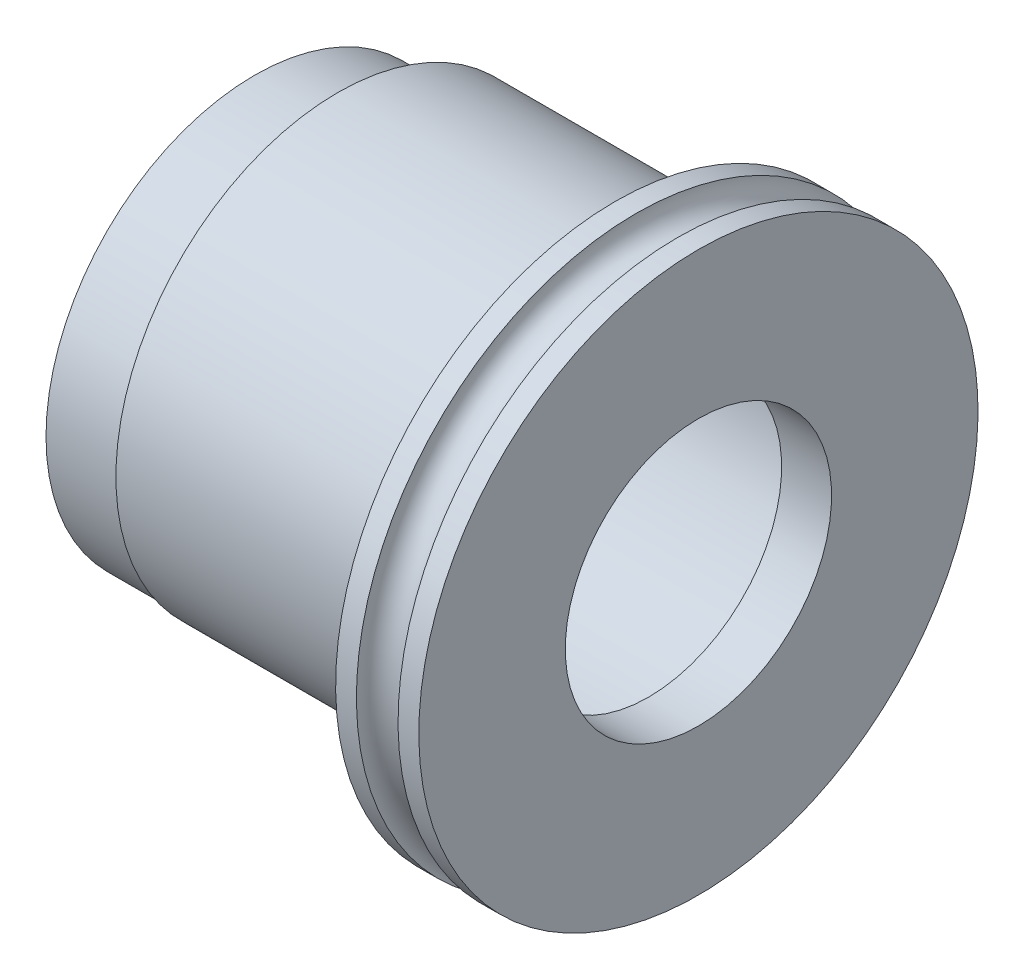
ISO-10303-21;
HEADER;
FILE_DESCRIPTION(('STEP AP214'),'2;1');
FILE_NAME('part.step','',(''),(''),'','','');
FILE_SCHEMA(('AUTOMOTIVE_DESIGN { 1 0 10303 214 1 1 1 1 }'));
ENDSEC;
DATA;
#1=APPLICATION_CONTEXT('core data for automotive mechanical design processes');
#2=APPLICATION_PROTOCOL_DEFINITION('international standard','automotive_design',2000,#1);
#3=PRODUCT_CONTEXT('',#1,'mechanical');
#4=PRODUCT('Part','Part','',(#3));
#5=PRODUCT_RELATED_PRODUCT_CATEGORY('part','',(#4));
#6=PRODUCT_DEFINITION_FORMATION('','',#4);
#7=PRODUCT_DEFINITION_CONTEXT('part definition',#1,'design');
#8=PRODUCT_DEFINITION('design','',#6,#7);
#9=PRODUCT_DEFINITION_SHAPE('','',#8);
#10=(LENGTH_UNIT() NAMED_UNIT(*) SI_UNIT(.MILLI.,.METRE.));
#11=(NAMED_UNIT(*) PLANE_ANGLE_UNIT() SI_UNIT($,.RADIAN.));
#12=(NAMED_UNIT(*) SI_UNIT($,.STERADIAN.) SOLID_ANGLE_UNIT());
#13=UNCERTAINTY_MEASURE_WITH_UNIT(LENGTH_MEASURE(1.E-05),#10,'distance_accuracy_value','');
#14=(GEOMETRIC_REPRESENTATION_CONTEXT(3) GLOBAL_UNCERTAINTY_ASSIGNED_CONTEXT((#13)) GLOBAL_UNIT_ASSIGNED_CONTEXT((#10,
#11,#12)) REPRESENTATION_CONTEXT('',''));
#15=CARTESIAN_POINT('',(0.,0.,0.));
#16=DIRECTION('',(0.,0.,1.));
#17=DIRECTION('',(1.,0.,0.));
#18=AXIS2_PLACEMENT_3D('',#15,#16,#17);
#19=CARTESIAN_POINT('',(-7.9375,0.,0.));
#20=DIRECTION('',(-1.,0.,0.));
#21=DIRECTION('',(0.,0.,1.));
#22=AXIS2_PLACEMENT_3D('',#19,#20,#21);
#23=CYLINDRICAL_SURFACE('',#22,12.7);
#24=CARTESIAN_POINT('',(-7.9375,0.,0.));
#25=DIRECTION('',(-1.,0.,0.));
#26=DIRECTION('',(0.,0.,1.));
#27=AXIS2_PLACEMENT_3D('',#24,#25,#26);
#28=CIRCLE('',#27,12.7);
#29=CARTESIAN_POINT('',(-7.9375,-12.7,0.));
#30=VERTEX_POINT('',#29);
#31=EDGE_CURVE('E11',#30,#30,#28,.T.);
#32=ORIENTED_EDGE('',*,*,#31,.F.);
#33=EDGE_LOOP('',(#32));
#34=FACE_BOUND('',#33,.T.);
#35=CARTESIAN_POINT('',(7.9375,0.,0.));
#36=DIRECTION('',(-1.,0.,0.));
#37=DIRECTION('',(0.,-1.,0.));
#38=AXIS2_PLACEMENT_3D('',#35,#36,#37);
#39=CIRCLE('',#38,12.7);
#40=CARTESIAN_POINT('',(7.9375,-12.7,0.));
#41=VERTEX_POINT('',#40);
#42=EDGE_CURVE('E38',#41,#41,#39,.T.);
#43=ORIENTED_EDGE('',*,*,#42,.T.);
#44=EDGE_LOOP('',(#43));
#45=FACE_BOUND('',#44,.T.);
#46=ADVANCED_FACE('F32',(#34,#45),#23,.T.);
#47=CARTESIAN_POINT('',(-7.9375,12.7,0.));
#48=DIRECTION('',(1.,0.,0.));
#49=DIRECTION('',(0.,0.,-1.));
#50=AXIS2_PLACEMENT_3D('',#47,#48,#49);
#51=PLANE('',#50);
#52=ORIENTED_EDGE('',*,*,#31,.T.);
#53=CARTESIAN_POINT('',(-7.9375,-0.762000000000002,0.));
#54=DIRECTION('',(1.,0.,0.));
#55=DIRECTION('',(0.,1.,0.));
#56=AXIS2_PLACEMENT_3D('',#53,#54,#55);
#57=CIRCLE('',#56,11.938);
#58=EDGE_CURVE('E42',#30,#30,#57,.T.);
#59=ORIENTED_EDGE('',*,*,#58,.T.);
#60=EDGE_LOOP('',(#52,#59));
#61=FACE_BOUND('',#60,.T.);
#62=ADVANCED_FACE('F98',(#61),#51,.F.);
#63=CARTESIAN_POINT('',(12.7,-0.761999999999992,0.));
#64=DIRECTION('',(1.,0.,0.));
#65=DIRECTION('',(0.,1.,0.));
#66=AXIS2_PLACEMENT_3D('',#63,#64,#65);
#67=PLANE('',#66);
#68=CARTESIAN_POINT('',(12.7,-0.761999999999998,0.));
#69=DIRECTION('',(1.,0.,0.));
#70=DIRECTION('',(0.,1.,0.));
#71=AXIS2_PLACEMENT_3D('',#68,#69,#70);
#72=CIRCLE('',#71,7.62000000000001);
#73=CARTESIAN_POINT('',(12.7,6.85800000000001,0.));
#74=VERTEX_POINT('',#73);
#75=EDGE_CURVE('E47',#74,#74,#72,.T.);
#76=ORIENTED_EDGE('',*,*,#75,.F.);
#77=EDGE_LOOP('',(#76));
#78=FACE_BOUND('',#77,.T.);
#79=CARTESIAN_POINT('',(12.7,-0.761999999999998,0.));
#80=DIRECTION('',(1.,0.,0.));
#81=DIRECTION('',(0.,1.,0.));
#82=AXIS2_PLACEMENT_3D('',#79,#80,#81);
#83=CIRCLE('',#82,16.002);
#84=CARTESIAN_POINT('',(12.7,15.24,0.));
#85=VERTEX_POINT('',#84);
#86=EDGE_CURVE('E65',#85,#85,#83,.T.);
#87=ORIENTED_EDGE('',*,*,#86,.T.);
#88=EDGE_LOOP('',(#87));
#89=FACE_BOUND('',#88,.T.);
#90=ADVANCED_FACE('F93',(#78,#89),#67,.T.);
#91=CARTESIAN_POINT('',(39.0649840387981,-0.761999999999992,0.));
#92=DIRECTION('',(1.,0.,0.));
#93=DIRECTION('',(0.,1.,0.));
#94=AXIS2_PLACEMENT_3D('',#91,#92,#93);
#95=CYLINDRICAL_SURFACE('',#94,16.002);
#96=CARTESIAN_POINT('',(11.509375,-0.761999999999998,0.));
#97=DIRECTION('',(1.,0.,0.));
#98=DIRECTION('',(0.,1.,0.));
#99=AXIS2_PLACEMENT_3D('',#96,#97,#98);
#100=CIRCLE('',#99,16.002);
#101=CARTESIAN_POINT('',(11.509375,15.24,0.));
#102=VERTEX_POINT('',#101);
#103=EDGE_CURVE('E62',#102,#102,#100,.T.);
#104=ORIENTED_EDGE('',*,*,#103,.T.);
#105=EDGE_LOOP('',(#104));
#106=FACE_BOUND('',#105,.T.);
#107=ORIENTED_EDGE('',*,*,#86,.F.);
#108=EDGE_LOOP('',(#107));
#109=FACE_BOUND('',#108,.T.);
#110=ADVANCED_FACE('F87',(#106,#109),#95,.T.);
#111=CARTESIAN_POINT('',(10.31875,-0.761999999999999,0.));
#112=DIRECTION('',(1.,0.,0.));
#113=DIRECTION('',(0.,1.,0.));
#114=AXIS2_PLACEMENT_3D('',#111,#112,#113);
#115=TOROIDAL_SURFACE('',#114,16.002,1.190625);
#116=CARTESIAN_POINT('',(9.128125,-0.761999999999998,0.));
#117=DIRECTION('',(1.,0.,0.));
#118=DIRECTION('',(0.,1.,0.));
#119=AXIS2_PLACEMENT_3D('',#116,#117,#118);
#120=CIRCLE('',#119,16.002);
#121=CARTESIAN_POINT('',(9.128125,15.24,0.));
#122=VERTEX_POINT('',#121);
#123=EDGE_CURVE('E59',#122,#122,#120,.T.);
#124=ORIENTED_EDGE('',*,*,#123,.T.);
#125=EDGE_LOOP('',(#124));
#126=FACE_BOUND('',#125,.T.);
#127=ORIENTED_EDGE('',*,*,#103,.F.);
#128=EDGE_LOOP('',(#127));
#129=FACE_BOUND('',#128,.T.);
#130=ADVANCED_FACE('F81',(#126,#129),#115,.F.);
#131=CARTESIAN_POINT('',(39.0649840387981,-0.761999999999992,0.));
#132=DIRECTION('',(1.,0.,0.));
#133=DIRECTION('',(0.,1.,0.));
#134=AXIS2_PLACEMENT_3D('',#131,#132,#133);
#135=CYLINDRICAL_SURFACE('',#134,16.002);
#136=CARTESIAN_POINT('',(7.9375,-0.761999999999999,0.));
#137=DIRECTION('',(1.,0.,0.));
#138=DIRECTION('',(0.,1.,0.));
#139=AXIS2_PLACEMENT_3D('',#136,#137,#138);
#140=CIRCLE('',#139,16.002);
#141=CARTESIAN_POINT('',(7.9375,15.24,0.));
#142=VERTEX_POINT('',#141);
#143=EDGE_CURVE('E50',#142,#142,#140,.T.);
#144=ORIENTED_EDGE('',*,*,#143,.T.);
#145=EDGE_LOOP('',(#144));
#146=FACE_BOUND('',#145,.T.);
#147=ORIENTED_EDGE('',*,*,#123,.F.);
#148=EDGE_LOOP('',(#147));
#149=FACE_BOUND('',#148,.T.);
#150=ADVANCED_FACE('F75',(#146,#149),#135,.T.);
#151=CARTESIAN_POINT('',(7.9375,-0.761999999999997,0.));
#152=DIRECTION('',(-1.,0.,0.));
#153=DIRECTION('',(0.,-1.,0.));
#154=AXIS2_PLACEMENT_3D('',#151,#152,#153);
#155=PLANE('',#154);
#156=ORIENTED_EDGE('',*,*,#42,.F.);
#157=EDGE_LOOP('',(#156));
#158=FACE_BOUND('',#157,.T.);
#159=ORIENTED_EDGE('',*,*,#143,.F.);
#160=EDGE_LOOP('',(#159));
#161=FACE_BOUND('',#160,.T.);
#162=ADVANCED_FACE('F71',(#158,#161),#155,.T.);
#163=CARTESIAN_POINT('',(-12.7,-0.761999999999992,0.));
#164=DIRECTION('',(1.,0.,0.));
#165=DIRECTION('',(0.,1.,0.));
#166=AXIS2_PLACEMENT_3D('',#163,#164,#165);
#167=PLANE('',#166);
#168=CARTESIAN_POINT('',(-12.7,-0.762000000000003,0.));
#169=DIRECTION('',(1.,0.,0.));
#170=DIRECTION('',(0.,1.,0.));
#171=AXIS2_PLACEMENT_3D('',#168,#169,#170);
#172=CIRCLE('',#171,11.);
#173=CARTESIAN_POINT('',(-12.7,10.238,0.));
#174=VERTEX_POINT('',#173);
#175=EDGE_CURVE('E199',#174,#174,#172,.T.);
#176=ORIENTED_EDGE('',*,*,#175,.T.);
#177=EDGE_LOOP('',(#176));
#178=FACE_BOUND('',#177,.T.);
#179=CARTESIAN_POINT('',(-12.7,-0.762000000000003,0.));
#180=DIRECTION('',(1.,0.,0.));
#181=DIRECTION('',(0.,1.,0.));
#182=AXIS2_PLACEMENT_3D('',#179,#180,#181);
#183=CIRCLE('',#182,11.938);
#184=CARTESIAN_POINT('',(-12.7,11.176,0.));
#185=VERTEX_POINT('',#184);
#186=EDGE_CURVE('E46',#185,#185,#183,.T.);
#187=ORIENTED_EDGE('',*,*,#186,.F.);
#188=EDGE_LOOP('',(#187));
#189=FACE_BOUND('',#188,.T.);
#190=ADVANCED_FACE('F74',(#178,#189),#167,.F.);
#191=CARTESIAN_POINT('',(39.0649840387981,-0.761999999999992,0.));
#192=DIRECTION('',(1.,0.,0.));
#193=DIRECTION('',(0.,1.,0.));
#194=AXIS2_PLACEMENT_3D('',#191,#192,#193);
#195=CYLINDRICAL_SURFACE('',#194,11.938);
#196=ORIENTED_EDGE('',*,*,#58,.F.);
#197=EDGE_LOOP('',(#196));
#198=FACE_BOUND('',#197,.T.);
#199=ORIENTED_EDGE('',*,*,#186,.T.);
#200=EDGE_LOOP('',(#199));
#201=FACE_BOUND('',#200,.T.);
#202=ADVANCED_FACE('F43',(#198,#201),#195,.T.);
#203=CARTESIAN_POINT('',(39.0649840387981,-0.761999999999992,0.));
#204=DIRECTION('',(1.,0.,0.));
#205=DIRECTION('',(0.,1.,0.));
#206=AXIS2_PLACEMENT_3D('',#203,#204,#205);
#207=CYLINDRICAL_SURFACE('',#206,7.62000000000001);
#208=ORIENTED_EDGE('',*,*,#75,.T.);
#209=EDGE_LOOP('',(#208));
#210=FACE_BOUND('',#209,.T.);
#211=CARTESIAN_POINT('',(9.8425,-0.761999999999998,0.));
#212=DIRECTION('',(1.,0.,0.));
#213=DIRECTION('',(0.,1.,0.));
#214=AXIS2_PLACEMENT_3D('',#211,#212,#213);
#215=CIRCLE('',#214,7.62000000000001);
#216=CARTESIAN_POINT('',(9.8425,6.85800000000001,0.));
#217=VERTEX_POINT('',#216);
#218=EDGE_CURVE('E53',#217,#217,#215,.T.);
#219=ORIENTED_EDGE('',*,*,#218,.F.);
#220=EDGE_LOOP('',(#219));
#221=FACE_BOUND('',#220,.T.);
#222=ADVANCED_FACE('F149',(#210,#221),#207,.F.);
#223=CARTESIAN_POINT('',(9.8425,0.,0.));
#224=DIRECTION('',(1.,0.,0.));
#225=DIRECTION('',(0.,1.,0.));
#226=AXIS2_PLACEMENT_3D('',#223,#224,#225);
#227=PLANE('',#226);
#228=CARTESIAN_POINT('',(9.8425,-0.761999999999998,0.));
#229=DIRECTION('',(1.,0.,0.));
#230=DIRECTION('',(0.,1.,0.));
#231=AXIS2_PLACEMENT_3D('',#228,#229,#230);
#232=CIRCLE('',#231,11.);
#233=CARTESIAN_POINT('',(9.8425,10.238,0.));
#234=VERTEX_POINT('',#233);
#235=EDGE_CURVE('E202',#234,#234,#232,.T.);
#236=ORIENTED_EDGE('',*,*,#235,.F.);
#237=EDGE_LOOP('',(#236));
#238=FACE_BOUND('',#237,.T.);
#239=ORIENTED_EDGE('',*,*,#218,.T.);
#240=EDGE_LOOP('',(#239));
#241=FACE_BOUND('',#240,.T.);
#242=ADVANCED_FACE('F171',(#238,#241),#227,.F.);
#243=CARTESIAN_POINT('',(39.0649840387981,-0.761999999999992,0.));
#244=DIRECTION('',(1.,0.,0.));
#245=DIRECTION('',(0.,1.,0.));
#246=AXIS2_PLACEMENT_3D('',#243,#244,#245);
#247=CYLINDRICAL_SURFACE('',#246,11.);
#248=ORIENTED_EDGE('',*,*,#175,.F.);
#249=EDGE_LOOP('',(#248));
#250=FACE_BOUND('',#249,.T.);
#251=ORIENTED_EDGE('',*,*,#235,.T.);
#252=EDGE_LOOP('',(#251));
#253=FACE_BOUND('',#252,.T.);
#254=ADVANCED_FACE('F182',(#250,#253),#247,.F.);
#255=CLOSED_SHELL('',(#46,#62,#90,#110,#130,#150,#162,#190,#202,#222,#242,#254));
#256=MANIFOLD_SOLID_BREP('B2',#255);
#257=ADVANCED_BREP_SHAPE_REPRESENTATION('',(#18,#256),#14);
#258=SHAPE_DEFINITION_REPRESENTATION(#9,#257);
ENDSEC;
END-ISO-10303-21;
